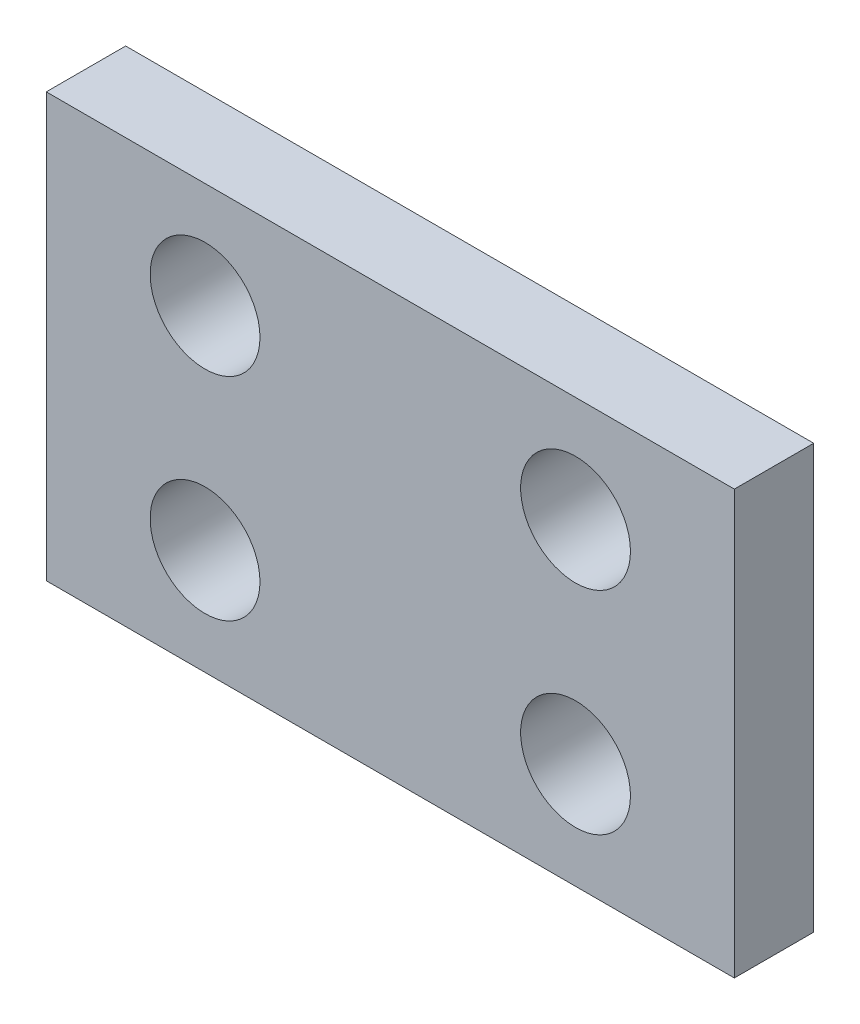
ISO-10303-21;
HEADER;
FILE_DESCRIPTION(('STEP AP214'),'2;1');
FILE_NAME('part.step','',(''),(''),'','','');
FILE_SCHEMA(('AUTOMOTIVE_DESIGN { 1 0 10303 214 1 1 1 1 }'));
ENDSEC;
DATA;
#1=APPLICATION_CONTEXT('core data for automotive mechanical design processes');
#2=APPLICATION_PROTOCOL_DEFINITION('international standard','automotive_design',2000,#1);
#3=PRODUCT_CONTEXT('',#1,'mechanical');
#4=PRODUCT('Part','Part','',(#3));
#5=PRODUCT_RELATED_PRODUCT_CATEGORY('part','',(#4));
#6=PRODUCT_DEFINITION_FORMATION('','',#4);
#7=PRODUCT_DEFINITION_CONTEXT('part definition',#1,'design');
#8=PRODUCT_DEFINITION('design','',#6,#7);
#9=PRODUCT_DEFINITION_SHAPE('','',#8);
#10=(LENGTH_UNIT() NAMED_UNIT(*) SI_UNIT(.MILLI.,.METRE.));
#11=(NAMED_UNIT(*) PLANE_ANGLE_UNIT() SI_UNIT($,.RADIAN.));
#12=(NAMED_UNIT(*) SI_UNIT($,.STERADIAN.) SOLID_ANGLE_UNIT());
#13=UNCERTAINTY_MEASURE_WITH_UNIT(LENGTH_MEASURE(1.E-05),#10,'distance_accuracy_value','');
#14=(GEOMETRIC_REPRESENTATION_CONTEXT(3) GLOBAL_UNCERTAINTY_ASSIGNED_CONTEXT((#13)) GLOBAL_UNIT_ASSIGNED_CONTEXT((#10,
#11,#12)) REPRESENTATION_CONTEXT('',''));
#15=CARTESIAN_POINT('',(0.,0.,0.));
#16=DIRECTION('',(0.,0.,1.));
#17=DIRECTION('',(1.,0.,0.));
#18=AXIS2_PLACEMENT_3D('',#15,#16,#17);
#19=CARTESIAN_POINT('',(0.,0.,3.));
#20=DIRECTION('',(1.,0.,0.));
#21=DIRECTION('',(0.,0.,-1.));
#22=AXIS2_PLACEMENT_3D('',#19,#20,#21);
#23=PLANE('',#22);
#24=DIRECTION('',(0.,-1.,0.));
#25=VECTOR('',#24,1.);
#26=CARTESIAN_POINT('',(0.,0.,0.));
#27=LINE('',#26,#25);
#28=CARTESIAN_POINT('',(0.,16.,0.));
#29=VERTEX_POINT('',#28);
#30=CARTESIAN_POINT('',(0.,0.,0.));
#31=VERTEX_POINT('',#30);
#32=EDGE_CURVE('E98',#29,#31,#27,.T.);
#33=ORIENTED_EDGE('',*,*,#32,.T.);
#34=DIRECTION('',(0.,0.,-1.));
#35=VECTOR('',#34,1.);
#36=CARTESIAN_POINT('',(0.,0.,3.));
#37=LINE('',#36,#35);
#38=CARTESIAN_POINT('',(0.,0.,3.));
#39=VERTEX_POINT('',#38);
#40=EDGE_CURVE('E11',#39,#31,#37,.T.);
#41=ORIENTED_EDGE('',*,*,#40,.F.);
#42=DIRECTION('',(0.,-1.,0.));
#43=VECTOR('',#42,1.);
#44=CARTESIAN_POINT('',(0.,0.,3.));
#45=LINE('',#44,#43);
#46=CARTESIAN_POINT('',(0.,16.,3.));
#47=VERTEX_POINT('',#46);
#48=EDGE_CURVE('E86',#47,#39,#45,.T.);
#49=ORIENTED_EDGE('',*,*,#48,.F.);
#50=DIRECTION('',(0.,0.,-1.));
#51=VECTOR('',#50,1.);
#52=CARTESIAN_POINT('',(0.,16.,3.));
#53=LINE('',#52,#51);
#54=EDGE_CURVE('E94',#47,#29,#53,.T.);
#55=ORIENTED_EDGE('',*,*,#54,.T.);
#56=EDGE_LOOP('',(#33,#41,#49,#55));
#57=FACE_BOUND('',#56,.T.);
#58=ADVANCED_FACE('F35',(#57),#23,.F.);
#59=CARTESIAN_POINT('',(0.,0.,3.));
#60=DIRECTION('',(0.,1.,0.));
#61=DIRECTION('',(0.,0.,1.));
#62=AXIS2_PLACEMENT_3D('',#59,#60,#61);
#63=PLANE('',#62);
#64=DIRECTION('',(1.,0.,0.));
#65=VECTOR('',#64,1.);
#66=CARTESIAN_POINT('',(0.,0.,0.));
#67=LINE('',#66,#65);
#68=CARTESIAN_POINT('',(26.,0.,0.));
#69=VERTEX_POINT('',#68);
#70=EDGE_CURVE('E90',#31,#69,#67,.T.);
#71=ORIENTED_EDGE('',*,*,#70,.T.);
#72=DIRECTION('',(0.,0.,-1.));
#73=VECTOR('',#72,1.);
#74=CARTESIAN_POINT('',(26.,0.,3.));
#75=LINE('',#74,#73);
#76=CARTESIAN_POINT('',(26.,0.,3.));
#77=VERTEX_POINT('',#76);
#78=EDGE_CURVE('E43',#77,#69,#75,.T.);
#79=ORIENTED_EDGE('',*,*,#78,.F.);
#80=DIRECTION('',(1.,0.,0.));
#81=VECTOR('',#80,1.);
#82=CARTESIAN_POINT('',(0.,0.,3.));
#83=LINE('',#82,#81);
#84=EDGE_CURVE('E81',#39,#77,#83,.T.);
#85=ORIENTED_EDGE('',*,*,#84,.F.);
#86=ORIENTED_EDGE('',*,*,#40,.T.);
#87=EDGE_LOOP('',(#71,#79,#85,#86));
#88=FACE_BOUND('',#87,.T.);
#89=ADVANCED_FACE('F89',(#88),#63,.F.);
#90=CARTESIAN_POINT('',(26.,0.,3.));
#91=DIRECTION('',(-1.,0.,0.));
#92=DIRECTION('',(0.,0.,1.));
#93=AXIS2_PLACEMENT_3D('',#90,#91,#92);
#94=PLANE('',#93);
#95=DIRECTION('',(0.,1.,0.));
#96=VECTOR('',#95,1.);
#97=CARTESIAN_POINT('',(26.,0.,0.));
#98=LINE('',#97,#96);
#99=CARTESIAN_POINT('',(26.,16.,0.));
#100=VERTEX_POINT('',#99);
#101=EDGE_CURVE('E68',#69,#100,#98,.T.);
#102=ORIENTED_EDGE('',*,*,#101,.T.);
#103=DIRECTION('',(0.,0.,-1.));
#104=VECTOR('',#103,1.);
#105=CARTESIAN_POINT('',(26.,16.,3.));
#106=LINE('',#105,#104);
#107=CARTESIAN_POINT('',(26.,16.,3.));
#108=VERTEX_POINT('',#107);
#109=EDGE_CURVE('E91',#108,#100,#106,.T.);
#110=ORIENTED_EDGE('',*,*,#109,.F.);
#111=DIRECTION('',(0.,1.,0.));
#112=VECTOR('',#111,1.);
#113=CARTESIAN_POINT('',(26.,0.,3.));
#114=LINE('',#113,#112);
#115=EDGE_CURVE('E84',#77,#108,#114,.T.);
#116=ORIENTED_EDGE('',*,*,#115,.F.);
#117=ORIENTED_EDGE('',*,*,#78,.T.);
#118=EDGE_LOOP('',(#102,#110,#116,#117));
#119=FACE_BOUND('',#118,.T.);
#120=ADVANCED_FACE('F92',(#119),#94,.F.);
#121=CARTESIAN_POINT('',(0.,16.,3.));
#122=DIRECTION('',(0.,-1.,0.));
#123=DIRECTION('',(0.,0.,-1.));
#124=AXIS2_PLACEMENT_3D('',#121,#122,#123);
#125=PLANE('',#124);
#126=DIRECTION('',(-1.,0.,0.));
#127=VECTOR('',#126,1.);
#128=CARTESIAN_POINT('',(0.,16.,0.));
#129=LINE('',#128,#127);
#130=EDGE_CURVE('E74',#100,#29,#129,.T.);
#131=ORIENTED_EDGE('',*,*,#130,.T.);
#132=ORIENTED_EDGE('',*,*,#54,.F.);
#133=DIRECTION('',(-1.,0.,0.));
#134=VECTOR('',#133,1.);
#135=CARTESIAN_POINT('',(0.,16.,3.));
#136=LINE('',#135,#134);
#137=EDGE_CURVE('E51',#108,#47,#136,.T.);
#138=ORIENTED_EDGE('',*,*,#137,.F.);
#139=ORIENTED_EDGE('',*,*,#109,.T.);
#140=EDGE_LOOP('',(#131,#132,#138,#139));
#141=FACE_BOUND('',#140,.T.);
#142=ADVANCED_FACE('F106',(#141),#125,.F.);
#143=CARTESIAN_POINT('',(0.,0.,3.));
#144=DIRECTION('',(0.,0.,-1.));
#145=DIRECTION('',(-1.,0.,0.));
#146=AXIS2_PLACEMENT_3D('',#143,#144,#145);
#147=PLANE('',#146);
#148=CARTESIAN_POINT('',(20.,12.,3.));
#149=DIRECTION('',(0.,0.,1.));
#150=DIRECTION('',(1.,0.,0.));
#151=AXIS2_PLACEMENT_3D('',#148,#149,#150);
#152=CIRCLE('',#151,2.07500000000001);
#153=CARTESIAN_POINT('',(22.075,12.,3.));
#154=VERTEX_POINT('',#153);
#155=EDGE_CURVE('E125',#154,#154,#152,.T.);
#156=ORIENTED_EDGE('',*,*,#155,.F.);
#157=EDGE_LOOP('',(#156));
#158=FACE_BOUND('',#157,.T.);
#159=CARTESIAN_POINT('',(6.,4.,3.));
#160=DIRECTION('',(0.,0.,1.));
#161=DIRECTION('',(1.,0.,0.));
#162=AXIS2_PLACEMENT_3D('',#159,#160,#161);
#163=CIRCLE('',#162,2.075);
#164=CARTESIAN_POINT('',(8.075,4.,3.));
#165=VERTEX_POINT('',#164);
#166=EDGE_CURVE('E118',#165,#165,#163,.T.);
#167=ORIENTED_EDGE('',*,*,#166,.F.);
#168=EDGE_LOOP('',(#167));
#169=FACE_BOUND('',#168,.T.);
#170=CARTESIAN_POINT('',(20.,4.,3.));
#171=DIRECTION('',(0.,0.,1.));
#172=DIRECTION('',(1.,0.,0.));
#173=AXIS2_PLACEMENT_3D('',#170,#171,#172);
#174=CIRCLE('',#173,2.07500000000001);
#175=CARTESIAN_POINT('',(22.075,4.,3.));
#176=VERTEX_POINT('',#175);
#177=EDGE_CURVE('E130',#176,#176,#174,.T.);
#178=ORIENTED_EDGE('',*,*,#177,.F.);
#179=EDGE_LOOP('',(#178));
#180=FACE_BOUND('',#179,.T.);
#181=CARTESIAN_POINT('',(5.99999999999999,12.,3.));
#182=DIRECTION('',(0.,0.,1.));
#183=DIRECTION('',(1.,0.,0.));
#184=AXIS2_PLACEMENT_3D('',#181,#182,#183);
#185=CIRCLE('',#184,2.075);
#186=CARTESIAN_POINT('',(8.075,12.,3.));
#187=VERTEX_POINT('',#186);
#188=EDGE_CURVE('E112',#187,#187,#185,.T.);
#189=ORIENTED_EDGE('',*,*,#188,.F.);
#190=EDGE_LOOP('',(#189));
#191=FACE_BOUND('',#190,.T.);
#192=ORIENTED_EDGE('',*,*,#48,.T.);
#193=ORIENTED_EDGE('',*,*,#84,.T.);
#194=ORIENTED_EDGE('',*,*,#115,.T.);
#195=ORIENTED_EDGE('',*,*,#137,.T.);
#196=EDGE_LOOP('',(#192,#193,#194,#195));
#197=FACE_BOUND('',#196,.T.);
#198=ADVANCED_FACE('F82',(#158,#169,#180,#191,#197),#147,.F.);
#199=CARTESIAN_POINT('',(0.,0.,0.));
#200=DIRECTION('',(0.,0.,-1.));
#201=DIRECTION('',(-1.,0.,0.));
#202=AXIS2_PLACEMENT_3D('',#199,#200,#201);
#203=PLANE('',#202);
#204=CARTESIAN_POINT('',(20.,12.,0.));
#205=DIRECTION('',(0.,0.,1.));
#206=DIRECTION('',(1.,0.,0.));
#207=AXIS2_PLACEMENT_3D('',#204,#205,#206);
#208=CIRCLE('',#207,2.07500000000001);
#209=CARTESIAN_POINT('',(22.075,12.,0.));
#210=VERTEX_POINT('',#209);
#211=EDGE_CURVE('E115',#210,#210,#208,.T.);
#212=ORIENTED_EDGE('',*,*,#211,.T.);
#213=EDGE_LOOP('',(#212));
#214=FACE_BOUND('',#213,.T.);
#215=CARTESIAN_POINT('',(6.,4.,0.));
#216=DIRECTION('',(0.,0.,1.));
#217=DIRECTION('',(1.,0.,0.));
#218=AXIS2_PLACEMENT_3D('',#215,#216,#217);
#219=CIRCLE('',#218,2.075);
#220=CARTESIAN_POINT('',(8.075,4.,0.));
#221=VERTEX_POINT('',#220);
#222=EDGE_CURVE('E121',#221,#221,#219,.T.);
#223=ORIENTED_EDGE('',*,*,#222,.T.);
#224=EDGE_LOOP('',(#223));
#225=FACE_BOUND('',#224,.T.);
#226=CARTESIAN_POINT('',(20.,4.,0.));
#227=DIRECTION('',(0.,0.,1.));
#228=DIRECTION('',(1.,0.,0.));
#229=AXIS2_PLACEMENT_3D('',#226,#227,#228);
#230=CIRCLE('',#229,2.07500000000001);
#231=CARTESIAN_POINT('',(22.075,4.,0.));
#232=VERTEX_POINT('',#231);
#233=EDGE_CURVE('E122',#232,#232,#230,.T.);
#234=ORIENTED_EDGE('',*,*,#233,.T.);
#235=EDGE_LOOP('',(#234));
#236=FACE_BOUND('',#235,.T.);
#237=CARTESIAN_POINT('',(5.99999999999999,12.,0.));
#238=DIRECTION('',(0.,0.,1.));
#239=DIRECTION('',(1.,0.,0.));
#240=AXIS2_PLACEMENT_3D('',#237,#238,#239);
#241=CIRCLE('',#240,2.075);
#242=CARTESIAN_POINT('',(8.075,12.,0.));
#243=VERTEX_POINT('',#242);
#244=EDGE_CURVE('E101',#243,#243,#241,.T.);
#245=ORIENTED_EDGE('',*,*,#244,.T.);
#246=EDGE_LOOP('',(#245));
#247=FACE_BOUND('',#246,.T.);
#248=ORIENTED_EDGE('',*,*,#32,.F.);
#249=ORIENTED_EDGE('',*,*,#130,.F.);
#250=ORIENTED_EDGE('',*,*,#101,.F.);
#251=ORIENTED_EDGE('',*,*,#70,.F.);
#252=EDGE_LOOP('',(#248,#249,#250,#251));
#253=FACE_BOUND('',#252,.T.);
#254=ADVANCED_FACE('F109',(#214,#225,#236,#247,#253),#203,.T.);
#255=CARTESIAN_POINT('',(5.99999999999999,12.,0.));
#256=DIRECTION('',(0.,0.,1.));
#257=DIRECTION('',(1.,0.,0.));
#258=AXIS2_PLACEMENT_3D('',#255,#256,#257);
#259=CYLINDRICAL_SURFACE('',#258,2.075);
#260=ORIENTED_EDGE('',*,*,#244,.F.);
#261=EDGE_LOOP('',(#260));
#262=FACE_BOUND('',#261,.T.);
#263=ORIENTED_EDGE('',*,*,#188,.T.);
#264=EDGE_LOOP('',(#263));
#265=FACE_BOUND('',#264,.T.);
#266=ADVANCED_FACE('F142',(#262,#265),#259,.F.);
#267=CARTESIAN_POINT('',(20.,4.,0.));
#268=DIRECTION('',(0.,0.,1.));
#269=DIRECTION('',(1.,0.,0.));
#270=AXIS2_PLACEMENT_3D('',#267,#268,#269);
#271=CYLINDRICAL_SURFACE('',#270,2.07500000000001);
#272=ORIENTED_EDGE('',*,*,#233,.F.);
#273=EDGE_LOOP('',(#272));
#274=FACE_BOUND('',#273,.T.);
#275=ORIENTED_EDGE('',*,*,#177,.T.);
#276=EDGE_LOOP('',(#275));
#277=FACE_BOUND('',#276,.T.);
#278=ADVANCED_FACE('F138',(#274,#277),#271,.F.);
#279=CARTESIAN_POINT('',(6.,4.,0.));
#280=DIRECTION('',(0.,0.,1.));
#281=DIRECTION('',(1.,0.,0.));
#282=AXIS2_PLACEMENT_3D('',#279,#280,#281);
#283=CYLINDRICAL_SURFACE('',#282,2.075);
#284=ORIENTED_EDGE('',*,*,#222,.F.);
#285=EDGE_LOOP('',(#284));
#286=FACE_BOUND('',#285,.T.);
#287=ORIENTED_EDGE('',*,*,#166,.T.);
#288=EDGE_LOOP('',(#287));
#289=FACE_BOUND('',#288,.T.);
#290=ADVANCED_FACE('F141',(#286,#289),#283,.F.);
#291=CARTESIAN_POINT('',(20.,12.,0.));
#292=DIRECTION('',(0.,0.,1.));
#293=DIRECTION('',(1.,0.,0.));
#294=AXIS2_PLACEMENT_3D('',#291,#292,#293);
#295=CYLINDRICAL_SURFACE('',#294,2.07500000000001);
#296=ORIENTED_EDGE('',*,*,#211,.F.);
#297=EDGE_LOOP('',(#296));
#298=FACE_BOUND('',#297,.T.);
#299=ORIENTED_EDGE('',*,*,#155,.T.);
#300=EDGE_LOOP('',(#299));
#301=FACE_BOUND('',#300,.T.);
#302=ADVANCED_FACE('F203',(#298,#301),#295,.F.);
#303=CLOSED_SHELL('',(#58,#89,#120,#142,#198,#254,#266,#278,#290,#302));
#304=MANIFOLD_SOLID_BREP('B2',#303);
#305=ADVANCED_BREP_SHAPE_REPRESENTATION('',(#18,#304),#14);
#306=SHAPE_DEFINITION_REPRESENTATION(#9,#305);
ENDSEC;
END-ISO-10303-21;
